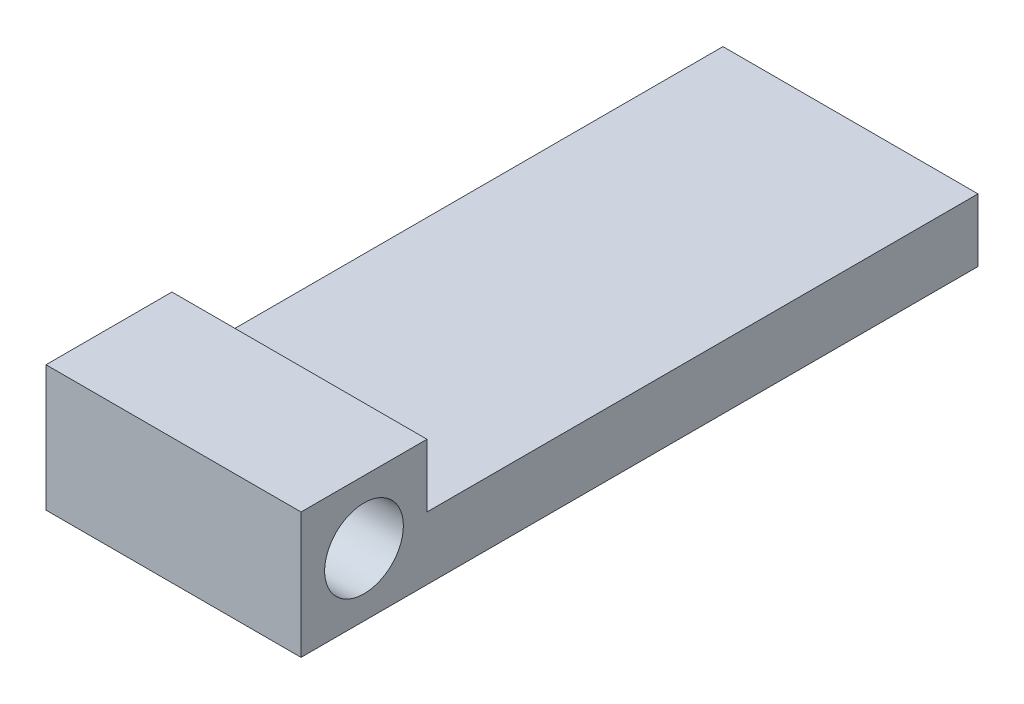
ISO-10303-21;
HEADER;
FILE_DESCRIPTION(('STEP AP214'),'2;1');
FILE_NAME('part.step','',(''),(''),'','','');
FILE_SCHEMA(('AUTOMOTIVE_DESIGN { 1 0 10303 214 1 1 1 1 }'));
ENDSEC;
DATA;
#1=APPLICATION_CONTEXT('core data for automotive mechanical design processes');
#2=APPLICATION_PROTOCOL_DEFINITION('international standard','automotive_design',2000,#1);
#3=PRODUCT_CONTEXT('',#1,'mechanical');
#4=PRODUCT('Part','Part','',(#3));
#5=PRODUCT_RELATED_PRODUCT_CATEGORY('part','',(#4));
#6=PRODUCT_DEFINITION_FORMATION('','',#4);
#7=PRODUCT_DEFINITION_CONTEXT('part definition',#1,'design');
#8=PRODUCT_DEFINITION('design','',#6,#7);
#9=PRODUCT_DEFINITION_SHAPE('','',#8);
#10=(LENGTH_UNIT() NAMED_UNIT(*) SI_UNIT(.MILLI.,.METRE.));
#11=(NAMED_UNIT(*) PLANE_ANGLE_UNIT() SI_UNIT($,.RADIAN.));
#12=(NAMED_UNIT(*) SI_UNIT($,.STERADIAN.) SOLID_ANGLE_UNIT());
#13=UNCERTAINTY_MEASURE_WITH_UNIT(LENGTH_MEASURE(1.E-05),#10,'distance_accuracy_value','');
#14=(GEOMETRIC_REPRESENTATION_CONTEXT(3) GLOBAL_UNCERTAINTY_ASSIGNED_CONTEXT((#13)) GLOBAL_UNIT_ASSIGNED_CONTEXT((#10,
#11,#12)) REPRESENTATION_CONTEXT('',''));
#15=CARTESIAN_POINT('',(0.,0.,0.));
#16=DIRECTION('',(0.,0.,1.));
#17=DIRECTION('',(1.,0.,0.));
#18=AXIS2_PLACEMENT_3D('',#15,#16,#17);
#19=CARTESIAN_POINT('',(0.,4.,0.));
#20=DIRECTION('',(1.,0.,0.));
#21=DIRECTION('',(0.,0.,-1.));
#22=AXIS2_PLACEMENT_3D('',#19,#20,#21);
#23=PLANE('',#22);
#24=CARTESIAN_POINT('',(0.,2.,-2.));
#25=DIRECTION('',(1.,0.,0.));
#26=DIRECTION('',(0.,0.,-1.));
#27=AXIS2_PLACEMENT_3D('',#24,#25,#26);
#28=CIRCLE('',#27,1.25);
#29=CARTESIAN_POINT('',(0.,2.,-3.25));
#30=VERTEX_POINT('',#29);
#31=EDGE_CURVE('E121',#30,#30,#28,.T.);
#32=ORIENTED_EDGE('',*,*,#31,.T.);
#33=EDGE_LOOP('',(#32));
#34=FACE_BOUND('',#33,.T.);
#35=DIRECTION('',(0.,0.,1.));
#36=VECTOR('',#35,1.);
#37=CARTESIAN_POINT('',(0.,0.,0.));
#38=LINE('',#37,#36);
#39=CARTESIAN_POINT('',(0.,0.,-21.5));
#40=VERTEX_POINT('',#39);
#41=CARTESIAN_POINT('',(0.,0.,0.));
#42=VERTEX_POINT('',#41);
#43=EDGE_CURVE('E124',#40,#42,#38,.T.);
#44=ORIENTED_EDGE('',*,*,#43,.T.);
#45=DIRECTION('',(0.,-1.,0.));
#46=VECTOR('',#45,1.);
#47=CARTESIAN_POINT('',(0.,4.,0.));
#48=LINE('',#47,#46);
#49=CARTESIAN_POINT('',(0.,4.,0.));
#50=VERTEX_POINT('',#49);
#51=EDGE_CURVE('E11',#50,#42,#48,.T.);
#52=ORIENTED_EDGE('',*,*,#51,.F.);
#53=DIRECTION('',(0.,0.,1.));
#54=VECTOR('',#53,1.);
#55=CARTESIAN_POINT('',(0.,4.,0.));
#56=LINE('',#55,#54);
#57=CARTESIAN_POINT('',(0.,4.,-4.));
#58=VERTEX_POINT('',#57);
#59=EDGE_CURVE('E125',#58,#50,#56,.T.);
#60=ORIENTED_EDGE('',*,*,#59,.F.);
#61=DIRECTION('',(0.,-1.,0.));
#62=VECTOR('',#61,1.);
#63=CARTESIAN_POINT('',(0.,4.,-4.));
#64=LINE('',#63,#62);
#65=CARTESIAN_POINT('',(0.,2.,-4.));
#66=VERTEX_POINT('',#65);
#67=EDGE_CURVE('E111',#58,#66,#64,.T.);
#68=ORIENTED_EDGE('',*,*,#67,.T.);
#69=DIRECTION('',(0.,0.,-1.));
#70=VECTOR('',#69,1.);
#71=CARTESIAN_POINT('',(0.,2.,-4.));
#72=LINE('',#71,#70);
#73=CARTESIAN_POINT('',(0.,2.,-21.5));
#74=VERTEX_POINT('',#73);
#75=EDGE_CURVE('E47',#66,#74,#72,.T.);
#76=ORIENTED_EDGE('',*,*,#75,.T.);
#77=DIRECTION('',(0.,-1.,0.));
#78=VECTOR('',#77,1.);
#79=CARTESIAN_POINT('',(0.,2.,-21.5));
#80=LINE('',#79,#78);
#81=EDGE_CURVE('E94',#74,#40,#80,.T.);
#82=ORIENTED_EDGE('',*,*,#81,.T.);
#83=EDGE_LOOP('',(#44,#52,#60,#68,#76,#82));
#84=FACE_BOUND('',#83,.T.);
#85=ADVANCED_FACE('F33',(#34,#84),#23,.F.);
#86=CARTESIAN_POINT('',(0.,4.,0.));
#87=DIRECTION('',(0.,0.,-1.));
#88=DIRECTION('',(-1.,0.,0.));
#89=AXIS2_PLACEMENT_3D('',#86,#87,#88);
#90=PLANE('',#89);
#91=DIRECTION('',(1.,0.,0.));
#92=VECTOR('',#91,1.);
#93=CARTESIAN_POINT('',(0.,0.,0.));
#94=LINE('',#93,#92);
#95=CARTESIAN_POINT('',(8.1,0.,0.));
#96=VERTEX_POINT('',#95);
#97=EDGE_CURVE('E70',#42,#96,#94,.T.);
#98=ORIENTED_EDGE('',*,*,#97,.T.);
#99=DIRECTION('',(0.,-1.,0.));
#100=VECTOR('',#99,1.);
#101=CARTESIAN_POINT('',(8.1,4.,0.));
#102=LINE('',#101,#100);
#103=CARTESIAN_POINT('',(8.1,4.,0.));
#104=VERTEX_POINT('',#103);
#105=EDGE_CURVE('E40',#104,#96,#102,.T.);
#106=ORIENTED_EDGE('',*,*,#105,.F.);
#107=DIRECTION('',(1.,0.,0.));
#108=VECTOR('',#107,1.);
#109=CARTESIAN_POINT('',(0.,4.,0.));
#110=LINE('',#109,#108);
#111=EDGE_CURVE('E75',#50,#104,#110,.T.);
#112=ORIENTED_EDGE('',*,*,#111,.F.);
#113=ORIENTED_EDGE('',*,*,#51,.T.);
#114=EDGE_LOOP('',(#98,#106,#112,#113));
#115=FACE_BOUND('',#114,.T.);
#116=ADVANCED_FACE('F146',(#115),#90,.F.);
#117=CARTESIAN_POINT('',(8.1,4.,0.));
#118=DIRECTION('',(-1.,0.,0.));
#119=DIRECTION('',(0.,0.,1.));
#120=AXIS2_PLACEMENT_3D('',#117,#118,#119);
#121=PLANE('',#120);
#122=CARTESIAN_POINT('',(8.1,2.,-2.));
#123=DIRECTION('',(1.,0.,0.));
#124=DIRECTION('',(0.,0.,-1.));
#125=AXIS2_PLACEMENT_3D('',#122,#123,#124);
#126=CIRCLE('',#125,1.25);
#127=CARTESIAN_POINT('',(8.1,2.,-3.25));
#128=VERTEX_POINT('',#127);
#129=EDGE_CURVE('E117',#128,#128,#126,.T.);
#130=ORIENTED_EDGE('',*,*,#129,.F.);
#131=EDGE_LOOP('',(#130));
#132=FACE_BOUND('',#131,.T.);
#133=DIRECTION('',(0.,0.,-1.));
#134=VECTOR('',#133,1.);
#135=CARTESIAN_POINT('',(8.1,0.,0.));
#136=LINE('',#135,#134);
#137=CARTESIAN_POINT('',(8.1,0.,-21.5));
#138=VERTEX_POINT('',#137);
#139=EDGE_CURVE('E127',#96,#138,#136,.T.);
#140=ORIENTED_EDGE('',*,*,#139,.T.);
#141=DIRECTION('',(0.,-1.,0.));
#142=VECTOR('',#141,1.);
#143=CARTESIAN_POINT('',(8.1,2.,-21.5));
#144=LINE('',#143,#142);
#145=CARTESIAN_POINT('',(8.1,2.,-21.5));
#146=VERTEX_POINT('',#145);
#147=EDGE_CURVE('E102',#146,#138,#144,.T.);
#148=ORIENTED_EDGE('',*,*,#147,.F.);
#149=DIRECTION('',(0.,0.,1.));
#150=VECTOR('',#149,1.);
#151=CARTESIAN_POINT('',(8.1,2.,-4.));
#152=LINE('',#151,#150);
#153=CARTESIAN_POINT('',(8.1,2.,-4.));
#154=VERTEX_POINT('',#153);
#155=EDGE_CURVE('E107',#146,#154,#152,.T.);
#156=ORIENTED_EDGE('',*,*,#155,.T.);
#157=DIRECTION('',(0.,-1.,0.));
#158=VECTOR('',#157,1.);
#159=CARTESIAN_POINT('',(8.1,4.,-4.));
#160=LINE('',#159,#158);
#161=CARTESIAN_POINT('',(8.1,4.,-4.));
#162=VERTEX_POINT('',#161);
#163=EDGE_CURVE('E136',#162,#154,#160,.T.);
#164=ORIENTED_EDGE('',*,*,#163,.F.);
#165=DIRECTION('',(0.,0.,-1.));
#166=VECTOR('',#165,1.);
#167=CARTESIAN_POINT('',(8.1,4.,0.));
#168=LINE('',#167,#166);
#169=EDGE_CURVE('E129',#104,#162,#168,.T.);
#170=ORIENTED_EDGE('',*,*,#169,.F.);
#171=ORIENTED_EDGE('',*,*,#105,.T.);
#172=EDGE_LOOP('',(#140,#148,#156,#164,#170,#171));
#173=FACE_BOUND('',#172,.T.);
#174=ADVANCED_FACE('F141',(#132,#173),#121,.F.);
#175=CARTESIAN_POINT('',(0.,4.,-4.));
#176=DIRECTION('',(0.,0.,1.));
#177=DIRECTION('',(1.,0.,0.));
#178=AXIS2_PLACEMENT_3D('',#175,#176,#177);
#179=PLANE('',#178);
#180=ORIENTED_EDGE('',*,*,#163,.T.);
#181=DIRECTION('',(-1.,0.,0.));
#182=VECTOR('',#181,1.);
#183=CARTESIAN_POINT('',(0.,2.,-4.));
#184=LINE('',#183,#182);
#185=EDGE_CURVE('E103',#154,#66,#184,.T.);
#186=ORIENTED_EDGE('',*,*,#185,.T.);
#187=ORIENTED_EDGE('',*,*,#67,.F.);
#188=DIRECTION('',(-1.,0.,0.));
#189=VECTOR('',#188,1.);
#190=CARTESIAN_POINT('',(0.,4.,-4.));
#191=LINE('',#190,#189);
#192=EDGE_CURVE('E56',#162,#58,#191,.T.);
#193=ORIENTED_EDGE('',*,*,#192,.F.);
#194=EDGE_LOOP('',(#180,#186,#187,#193));
#195=FACE_BOUND('',#194,.T.);
#196=ADVANCED_FACE('F152',(#195),#179,.F.);
#197=CARTESIAN_POINT('',(0.,4.,0.));
#198=DIRECTION('',(0.,-1.,0.));
#199=DIRECTION('',(0.,0.,-1.));
#200=AXIS2_PLACEMENT_3D('',#197,#198,#199);
#201=PLANE('',#200);
#202=ORIENTED_EDGE('',*,*,#59,.T.);
#203=ORIENTED_EDGE('',*,*,#111,.T.);
#204=ORIENTED_EDGE('',*,*,#169,.T.);
#205=ORIENTED_EDGE('',*,*,#192,.T.);
#206=EDGE_LOOP('',(#202,#203,#204,#205));
#207=FACE_BOUND('',#206,.T.);
#208=ADVANCED_FACE('F159',(#207),#201,.F.);
#209=CARTESIAN_POINT('',(0.,0.,0.));
#210=DIRECTION('',(0.,-1.,0.));
#211=DIRECTION('',(0.,0.,-1.));
#212=AXIS2_PLACEMENT_3D('',#209,#210,#211);
#213=PLANE('',#212);
#214=ORIENTED_EDGE('',*,*,#43,.F.);
#215=DIRECTION('',(1.,0.,0.));
#216=VECTOR('',#215,1.);
#217=CARTESIAN_POINT('',(0.,0.,-21.5));
#218=LINE('',#217,#216);
#219=EDGE_CURVE('E99',#40,#138,#218,.T.);
#220=ORIENTED_EDGE('',*,*,#219,.T.);
#221=ORIENTED_EDGE('',*,*,#139,.F.);
#222=ORIENTED_EDGE('',*,*,#97,.F.);
#223=EDGE_LOOP('',(#214,#220,#221,#222));
#224=FACE_BOUND('',#223,.T.);
#225=ADVANCED_FACE('F144',(#224),#213,.T.);
#226=CARTESIAN_POINT('',(-0.900000000000001,2.,-2.));
#227=DIRECTION('',(1.,0.,0.));
#228=DIRECTION('',(0.,0.,-1.));
#229=AXIS2_PLACEMENT_3D('',#226,#227,#228);
#230=CYLINDRICAL_SURFACE('',#229,1.25);
#231=ORIENTED_EDGE('',*,*,#129,.T.);
#232=EDGE_LOOP('',(#231));
#233=FACE_BOUND('',#232,.T.);
#234=ORIENTED_EDGE('',*,*,#31,.F.);
#235=EDGE_LOOP('',(#234));
#236=FACE_BOUND('',#235,.T.);
#237=ADVANCED_FACE('F163',(#233,#236),#230,.F.);
#238=CARTESIAN_POINT('',(0.,2.,-21.5));
#239=DIRECTION('',(0.,0.,-1.));
#240=DIRECTION('',(-1.,0.,0.));
#241=AXIS2_PLACEMENT_3D('',#238,#239,#240);
#242=PLANE('',#241);
#243=ORIENTED_EDGE('',*,*,#219,.F.);
#244=ORIENTED_EDGE('',*,*,#81,.F.);
#245=DIRECTION('',(1.,0.,0.));
#246=VECTOR('',#245,1.);
#247=CARTESIAN_POINT('',(0.,2.,-21.5));
#248=LINE('',#247,#246);
#249=EDGE_CURVE('E97',#74,#146,#248,.T.);
#250=ORIENTED_EDGE('',*,*,#249,.T.);
#251=ORIENTED_EDGE('',*,*,#147,.T.);
#252=EDGE_LOOP('',(#243,#244,#250,#251));
#253=FACE_BOUND('',#252,.T.);
#254=ADVANCED_FACE('F95',(#253),#242,.T.);
#255=CARTESIAN_POINT('',(0.,2.,0.));
#256=DIRECTION('',(0.,-1.,0.));
#257=DIRECTION('',(0.,0.,-1.));
#258=AXIS2_PLACEMENT_3D('',#255,#256,#257);
#259=PLANE('',#258);
#260=ORIENTED_EDGE('',*,*,#75,.F.);
#261=ORIENTED_EDGE('',*,*,#185,.F.);
#262=ORIENTED_EDGE('',*,*,#155,.F.);
#263=ORIENTED_EDGE('',*,*,#249,.F.);
#264=EDGE_LOOP('',(#260,#261,#262,#263));
#265=FACE_BOUND('',#264,.T.);
#266=ADVANCED_FACE('F106',(#265),#259,.F.);
#267=CLOSED_SHELL('',(#85,#116,#174,#196,#208,#225,#237,#254,#266));
#268=MANIFOLD_SOLID_BREP('B2',#267);
#269=ADVANCED_BREP_SHAPE_REPRESENTATION('',(#18,#268),#14);
#270=SHAPE_DEFINITION_REPRESENTATION(#9,#269);
ENDSEC;
END-ISO-10303-21;
